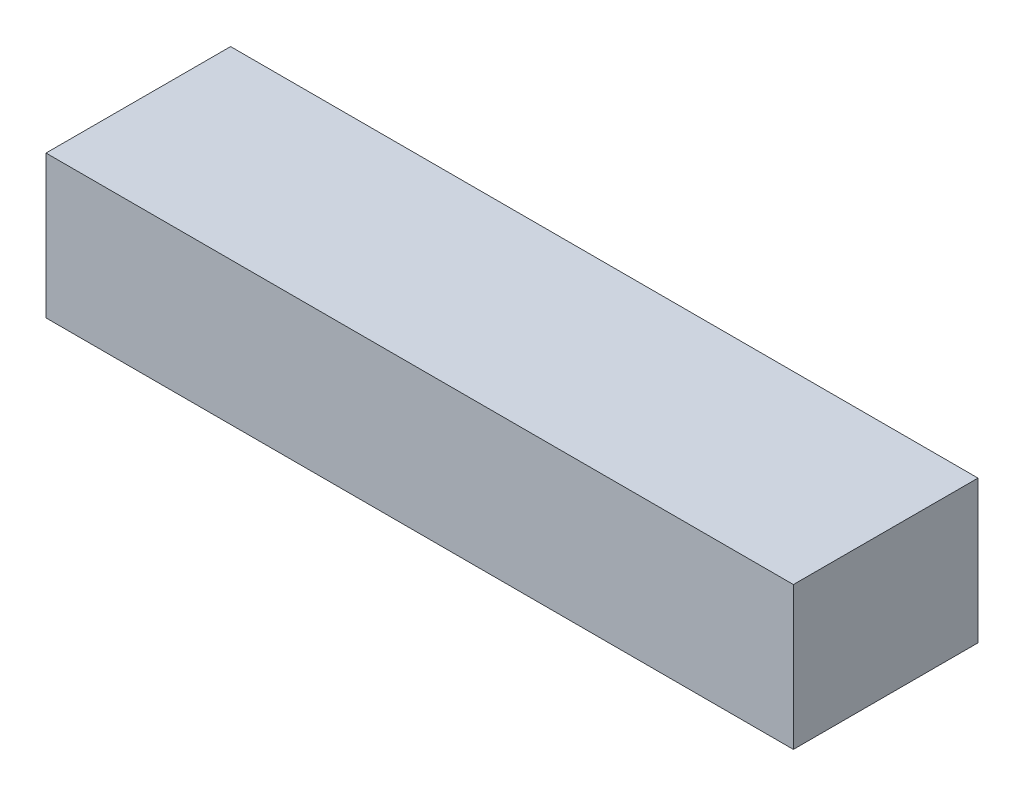
ISO-10303-21;
HEADER;
FILE_DESCRIPTION(('STEP AP214'),'2;1');
FILE_NAME('part.step','',(''),(''),'','','');
FILE_SCHEMA(('AUTOMOTIVE_DESIGN { 1 0 10303 214 1 1 1 1 }'));
ENDSEC;
DATA;
#1=APPLICATION_CONTEXT('core data for automotive mechanical design processes');
#2=APPLICATION_PROTOCOL_DEFINITION('international standard','automotive_design',2000,#1);
#3=PRODUCT_CONTEXT('',#1,'mechanical');
#4=PRODUCT('Part','Part','',(#3));
#5=PRODUCT_RELATED_PRODUCT_CATEGORY('part','',(#4));
#6=PRODUCT_DEFINITION_FORMATION('','',#4);
#7=PRODUCT_DEFINITION_CONTEXT('part definition',#1,'design');
#8=PRODUCT_DEFINITION('design','',#6,#7);
#9=PRODUCT_DEFINITION_SHAPE('','',#8);
#10=(LENGTH_UNIT() NAMED_UNIT(*) SI_UNIT(.MILLI.,.METRE.));
#11=(NAMED_UNIT(*) PLANE_ANGLE_UNIT() SI_UNIT($,.RADIAN.));
#12=(NAMED_UNIT(*) SI_UNIT($,.STERADIAN.) SOLID_ANGLE_UNIT());
#13=UNCERTAINTY_MEASURE_WITH_UNIT(LENGTH_MEASURE(1.E-05),#10,'distance_accuracy_value','');
#14=(GEOMETRIC_REPRESENTATION_CONTEXT(3) GLOBAL_UNCERTAINTY_ASSIGNED_CONTEXT((#13)) GLOBAL_UNIT_ASSIGNED_CONTEXT((#10,
#11,#12)) REPRESENTATION_CONTEXT('',''));
#15=CARTESIAN_POINT('',(0.,0.,0.));
#16=DIRECTION('',(0.,0.,1.));
#17=DIRECTION('',(1.,0.,0.));
#18=AXIS2_PLACEMENT_3D('',#15,#16,#17);
#19=CARTESIAN_POINT('',(0.,29.4525692159948,-38.1));
#20=DIRECTION('',(-1.,0.,0.));
#21=DIRECTION('',(0.,-1.,0.));
#22=AXIS2_PLACEMENT_3D('',#19,#20,#21);
#23=PLANE('',#22);
#24=DIRECTION('',(0.,-1.,0.));
#25=VECTOR('',#24,1.);
#26=CARTESIAN_POINT('',(0.,14.7262846079974,-38.1));
#27=LINE('',#26,#25);
#28=CARTESIAN_POINT('',(0.,29.4525692159948,-38.1));
#29=VERTEX_POINT('',#28);
#30=CARTESIAN_POINT('',(0.,0.,-38.1));
#31=VERTEX_POINT('',#30);
#32=EDGE_CURVE('E12',#29,#31,#27,.T.);
#33=ORIENTED_EDGE('',*,*,#32,.T.);
#34=DIRECTION('',(0.,0.,1.));
#35=VECTOR('',#34,1.);
#36=CARTESIAN_POINT('',(0.,0.,-19.05));
#37=LINE('',#36,#35);
#38=CARTESIAN_POINT('',(0.,0.,0.));
#39=VERTEX_POINT('',#38);
#40=EDGE_CURVE('E104',#31,#39,#37,.T.);
#41=ORIENTED_EDGE('',*,*,#40,.T.);
#42=DIRECTION('',(0.,-1.,0.));
#43=VECTOR('',#42,1.);
#44=CARTESIAN_POINT('',(0.,14.7371411200092,0.));
#45=LINE('',#44,#43);
#46=CARTESIAN_POINT('',(0.,29.4742822400185,0.));
#47=VERTEX_POINT('',#46);
#48=EDGE_CURVE('E146',#47,#39,#45,.T.);
#49=ORIENTED_EDGE('',*,*,#48,.F.);
#50=DIRECTION('',(0.,0.000569895551120473,0.999999837609517));
#51=VECTOR('',#50,1.);
#52=CARTESIAN_POINT('',(0.,29.4634257280066,-19.05));
#53=LINE('',#52,#51);
#54=EDGE_CURVE('E168',#29,#47,#53,.T.);
#55=ORIENTED_EDGE('',*,*,#54,.F.);
#56=EDGE_LOOP('',(#33,#41,#49,#55));
#57=FACE_BOUND('',#56,.T.);
#58=ADVANCED_FACE('F93',(#57),#23,.T.);
#59=CARTESIAN_POINT('',(0.,0.,-38.1));
#60=DIRECTION('',(0.,-1.,0.));
#61=DIRECTION('',(1.,0.,0.));
#62=AXIS2_PLACEMENT_3D('',#59,#60,#61);
#63=PLANE('',#62);
#64=DIRECTION('',(1.,0.,0.));
#65=VECTOR('',#64,1.);
#66=CARTESIAN_POINT('',(77.1282200015904,0.,-38.1));
#67=LINE('',#66,#65);
#68=CARTESIAN_POINT('',(154.256440003181,0.,-38.1));
#69=VERTEX_POINT('',#68);
#70=EDGE_CURVE('E113',#31,#69,#67,.T.);
#71=ORIENTED_EDGE('',*,*,#70,.T.);
#72=DIRECTION('',(0.,0.,1.));
#73=VECTOR('',#72,1.);
#74=CARTESIAN_POINT('',(154.256440003181,0.,-19.05));
#75=LINE('',#74,#73);
#76=CARTESIAN_POINT('',(154.256440003181,0.,0.));
#77=VERTEX_POINT('',#76);
#78=EDGE_CURVE('E137',#69,#77,#75,.T.);
#79=ORIENTED_EDGE('',*,*,#78,.T.);
#80=DIRECTION('',(1.,0.,0.));
#81=VECTOR('',#80,1.);
#82=CARTESIAN_POINT('',(77.1282200015904,0.,0.));
#83=LINE('',#82,#81);
#84=EDGE_CURVE('E142',#39,#77,#83,.T.);
#85=ORIENTED_EDGE('',*,*,#84,.F.);
#86=ORIENTED_EDGE('',*,*,#40,.F.);
#87=EDGE_LOOP('',(#71,#79,#85,#86));
#88=FACE_BOUND('',#87,.T.);
#89=ADVANCED_FACE('F152',(#88),#63,.T.);
#90=CARTESIAN_POINT('',(154.256440003181,0.,-38.1));
#91=DIRECTION('',(1.,0.,0.));
#92=DIRECTION('',(0.,1.,0.));
#93=AXIS2_PLACEMENT_3D('',#90,#91,#92);
#94=PLANE('',#93);
#95=DIRECTION('',(0.,1.,0.));
#96=VECTOR('',#95,1.);
#97=CARTESIAN_POINT('',(154.256440003181,14.7262846079974,-38.1));
#98=LINE('',#97,#96);
#99=CARTESIAN_POINT('',(154.256440003181,29.4525692159948,-38.1));
#100=VERTEX_POINT('',#99);
#101=EDGE_CURVE('E154',#69,#100,#98,.T.);
#102=ORIENTED_EDGE('',*,*,#101,.T.);
#103=DIRECTION('',(0.,0.000569895551120655,0.999999837609517));
#104=VECTOR('',#103,1.);
#105=CARTESIAN_POINT('',(154.256440003181,29.4634257280066,-19.05));
#106=LINE('',#105,#104);
#107=CARTESIAN_POINT('',(154.256440003181,29.4742822400185,0.));
#108=VERTEX_POINT('',#107);
#109=EDGE_CURVE('E139',#100,#108,#106,.T.);
#110=ORIENTED_EDGE('',*,*,#109,.T.);
#111=DIRECTION('',(0.,1.,0.));
#112=VECTOR('',#111,1.);
#113=CARTESIAN_POINT('',(154.256440003181,14.7371411200092,0.));
#114=LINE('',#113,#112);
#115=EDGE_CURVE('E132',#77,#108,#114,.T.);
#116=ORIENTED_EDGE('',*,*,#115,.F.);
#117=ORIENTED_EDGE('',*,*,#78,.F.);
#118=EDGE_LOOP('',(#102,#110,#116,#117));
#119=FACE_BOUND('',#118,.T.);
#120=ADVANCED_FACE('F135',(#119),#94,.T.);
#121=CARTESIAN_POINT('',(154.256440003181,29.4525692159948,-38.1));
#122=DIRECTION('',(0.,0.999999837609517,-0.000569895551120655));
#123=DIRECTION('',(-1.,0.,0.));
#124=AXIS2_PLACEMENT_3D('',#121,#122,#123);
#125=PLANE('',#124);
#126=DIRECTION('',(-1.,0.,0.));
#127=VECTOR('',#126,1.);
#128=CARTESIAN_POINT('',(77.1282200015904,29.4525692159948,-38.1));
#129=LINE('',#128,#127);
#130=EDGE_CURVE('E164',#100,#29,#129,.T.);
#131=ORIENTED_EDGE('',*,*,#130,.T.);
#132=ORIENTED_EDGE('',*,*,#54,.T.);
#133=DIRECTION('',(-1.,0.,0.));
#134=VECTOR('',#133,1.);
#135=CARTESIAN_POINT('',(77.1282200015904,29.4742822400185,0.));
#136=LINE('',#135,#134);
#137=EDGE_CURVE('E97',#108,#47,#136,.T.);
#138=ORIENTED_EDGE('',*,*,#137,.F.);
#139=ORIENTED_EDGE('',*,*,#109,.F.);
#140=EDGE_LOOP('',(#131,#132,#138,#139));
#141=FACE_BOUND('',#140,.T.);
#142=ADVANCED_FACE('F95',(#141),#125,.T.);
#143=CARTESIAN_POINT('',(0.,0.,-38.1));
#144=DIRECTION('',(0.,0.,1.));
#145=DIRECTION('',(0.,-1.,0.));
#146=AXIS2_PLACEMENT_3D('',#143,#144,#145);
#147=PLANE('',#146);
#148=ORIENTED_EDGE('',*,*,#130,.F.);
#149=ORIENTED_EDGE('',*,*,#101,.F.);
#150=ORIENTED_EDGE('',*,*,#70,.F.);
#151=ORIENTED_EDGE('',*,*,#32,.F.);
#152=EDGE_LOOP('',(#148,#149,#150,#151));
#153=FACE_BOUND('',#152,.T.);
#154=ADVANCED_FACE('F178',(#153),#147,.F.);
#155=CARTESIAN_POINT('',(0.,0.,0.));
#156=DIRECTION('',(0.,0.,1.));
#157=DIRECTION('',(0.,-1.,0.));
#158=AXIS2_PLACEMENT_3D('',#155,#156,#157);
#159=PLANE('',#158);
#160=ORIENTED_EDGE('',*,*,#48,.T.);
#161=ORIENTED_EDGE('',*,*,#84,.T.);
#162=ORIENTED_EDGE('',*,*,#115,.T.);
#163=ORIENTED_EDGE('',*,*,#137,.T.);
#164=EDGE_LOOP('',(#160,#161,#162,#163));
#165=FACE_BOUND('',#164,.T.);
#166=ADVANCED_FACE('F144',(#165),#159,.T.);
#167=CLOSED_SHELL('',(#58,#89,#120,#142,#154,#166));
#168=MANIFOLD_SOLID_BREP('B2',#167);
#169=ADVANCED_BREP_SHAPE_REPRESENTATION('',(#18,#168),#14);
#170=SHAPE_DEFINITION_REPRESENTATION(#9,#169);
ENDSEC;
END-ISO-10303-21;
